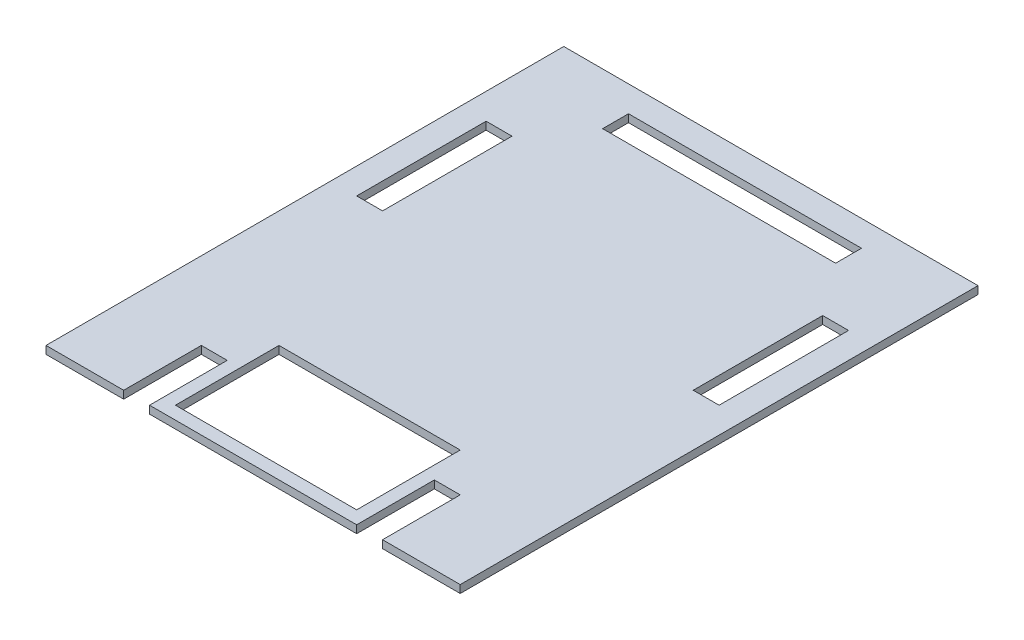
ISO-10303-21;
HEADER;
FILE_DESCRIPTION(('STEP AP214'),'2;1');
FILE_NAME('part.step','',(''),(''),'','','');
FILE_SCHEMA(('AUTOMOTIVE_DESIGN { 1 0 10303 214 1 1 1 1 }'));
ENDSEC;
DATA;
#1=APPLICATION_CONTEXT('core data for automotive mechanical design processes');
#2=APPLICATION_PROTOCOL_DEFINITION('international standard','automotive_design',2000,#1);
#3=PRODUCT_CONTEXT('',#1,'mechanical');
#4=PRODUCT('Part','Part','',(#3));
#5=PRODUCT_RELATED_PRODUCT_CATEGORY('part','',(#4));
#6=PRODUCT_DEFINITION_FORMATION('','',#4);
#7=PRODUCT_DEFINITION_CONTEXT('part definition',#1,'design');
#8=PRODUCT_DEFINITION('design','',#6,#7);
#9=PRODUCT_DEFINITION_SHAPE('','',#8);
#10=(LENGTH_UNIT() NAMED_UNIT(*) SI_UNIT(.MILLI.,.METRE.));
#11=(NAMED_UNIT(*) PLANE_ANGLE_UNIT() SI_UNIT($,.RADIAN.));
#12=(NAMED_UNIT(*) SI_UNIT($,.STERADIAN.) SOLID_ANGLE_UNIT());
#13=UNCERTAINTY_MEASURE_WITH_UNIT(LENGTH_MEASURE(1.E-05),#10,'distance_accuracy_value','');
#14=(GEOMETRIC_REPRESENTATION_CONTEXT(3) GLOBAL_UNCERTAINTY_ASSIGNED_CONTEXT((#13)) GLOBAL_UNIT_ASSIGNED_CONTEXT((#10,
#11,#12)) REPRESENTATION_CONTEXT('',''));
#15=CARTESIAN_POINT('',(0.,0.,0.));
#16=DIRECTION('',(0.,0.,1.));
#17=DIRECTION('',(1.,0.,0.));
#18=AXIS2_PLACEMENT_3D('',#15,#16,#17);
#19=CARTESIAN_POINT('',(0.,3.,-3.62105263157893));
#20=DIRECTION('',(0.,0.,1.));
#21=DIRECTION('',(1.,0.,0.));
#22=AXIS2_PLACEMENT_3D('',#19,#20,#21);
#23=PLANE('',#22);
#24=DIRECTION('',(-1.,0.,0.));
#25=VECTOR('',#24,1.);
#26=CARTESIAN_POINT('',(0.,0.,-3.62105263157893));
#27=LINE('',#26,#25);
#28=CARTESIAN_POINT('',(-60.,0.,-3.62105263157893));
#29=VERTEX_POINT('',#28);
#30=CARTESIAN_POINT('',(-70.,0.,-3.62105263157893));
#31=VERTEX_POINT('',#30);
#32=EDGE_CURVE('E385',#29,#31,#27,.T.);
#33=ORIENTED_EDGE('',*,*,#32,.F.);
#34=DIRECTION('',(0.,-1.,0.));
#35=VECTOR('',#34,1.);
#36=CARTESIAN_POINT('',(-60.,3.,-3.62105263157893));
#37=LINE('',#36,#35);
#38=CARTESIAN_POINT('',(-60.,3.,-3.62105263157893));
#39=VERTEX_POINT('',#38);
#40=EDGE_CURVE('E11',#39,#29,#37,.T.);
#41=ORIENTED_EDGE('',*,*,#40,.F.);
#42=DIRECTION('',(-1.,0.,0.));
#43=VECTOR('',#42,1.);
#44=CARTESIAN_POINT('',(0.,3.,-3.62105263157893));
#45=LINE('',#44,#43);
#46=CARTESIAN_POINT('',(-70.,3.,-3.62105263157893));
#47=VERTEX_POINT('',#46);
#48=EDGE_CURVE('E240',#39,#47,#45,.T.);
#49=ORIENTED_EDGE('',*,*,#48,.T.);
#50=DIRECTION('',(0.,-1.,0.));
#51=VECTOR('',#50,1.);
#52=CARTESIAN_POINT('',(-70.,3.,-3.62105263157893));
#53=LINE('',#52,#51);
#54=EDGE_CURVE('E54',#47,#31,#53,.T.);
#55=ORIENTED_EDGE('',*,*,#54,.T.);
#56=EDGE_LOOP('',(#33,#41,#49,#55));
#57=FACE_BOUND('',#56,.T.);
#58=ADVANCED_FACE('F35',(#57),#23,.T.);
#59=CARTESIAN_POINT('',(-60.,3.,0.));
#60=DIRECTION('',(1.,0.,0.));
#61=DIRECTION('',(0.,0.,-1.));
#62=AXIS2_PLACEMENT_3D('',#59,#60,#61);
#63=PLANE('',#62);
#64=DIRECTION('',(0.,0.,1.));
#65=VECTOR('',#64,1.);
#66=CARTESIAN_POINT('',(-60.,0.,0.));
#67=LINE('',#66,#65);
#68=CARTESIAN_POINT('',(-60.,0.,46.3789473684211));
#69=VERTEX_POINT('',#68);
#70=EDGE_CURVE('E245',#29,#69,#67,.T.);
#71=ORIENTED_EDGE('',*,*,#70,.T.);
#72=DIRECTION('',(0.,-1.,0.));
#73=VECTOR('',#72,1.);
#74=CARTESIAN_POINT('',(-60.,3.,46.3789473684211));
#75=LINE('',#74,#73);
#76=CARTESIAN_POINT('',(-60.,3.,46.3789473684211));
#77=VERTEX_POINT('',#76);
#78=EDGE_CURVE('E45',#77,#69,#75,.T.);
#79=ORIENTED_EDGE('',*,*,#78,.F.);
#80=DIRECTION('',(0.,0.,1.));
#81=VECTOR('',#80,1.);
#82=CARTESIAN_POINT('',(-60.,3.,0.));
#83=LINE('',#82,#81);
#84=EDGE_CURVE('E235',#39,#77,#83,.T.);
#85=ORIENTED_EDGE('',*,*,#84,.F.);
#86=ORIENTED_EDGE('',*,*,#40,.T.);
#87=EDGE_LOOP('',(#71,#79,#85,#86));
#88=FACE_BOUND('',#87,.T.);
#89=ADVANCED_FACE('F243',(#88),#63,.F.);
#90=CARTESIAN_POINT('',(0.,3.,46.3789473684211));
#91=DIRECTION('',(0.,0.,1.));
#92=DIRECTION('',(1.,0.,0.));
#93=AXIS2_PLACEMENT_3D('',#90,#91,#92);
#94=PLANE('',#93);
#95=DIRECTION('',(-1.,0.,0.));
#96=VECTOR('',#95,1.);
#97=CARTESIAN_POINT('',(0.,0.,46.3789473684211));
#98=LINE('',#97,#96);
#99=CARTESIAN_POINT('',(-70.,0.,46.3789473684211));
#100=VERTEX_POINT('',#99);
#101=EDGE_CURVE('E388',#69,#100,#98,.T.);
#102=ORIENTED_EDGE('',*,*,#101,.T.);
#103=DIRECTION('',(0.,-1.,0.));
#104=VECTOR('',#103,1.);
#105=CARTESIAN_POINT('',(-70.,3.,46.3789473684211));
#106=LINE('',#105,#104);
#107=CARTESIAN_POINT('',(-70.,3.,46.3789473684211));
#108=VERTEX_POINT('',#107);
#109=EDGE_CURVE('E140',#108,#100,#106,.T.);
#110=ORIENTED_EDGE('',*,*,#109,.F.);
#111=DIRECTION('',(-1.,0.,0.));
#112=VECTOR('',#111,1.);
#113=CARTESIAN_POINT('',(0.,3.,46.3789473684211));
#114=LINE('',#113,#112);
#115=EDGE_CURVE('E227',#77,#108,#114,.T.);
#116=ORIENTED_EDGE('',*,*,#115,.F.);
#117=ORIENTED_EDGE('',*,*,#78,.T.);
#118=EDGE_LOOP('',(#102,#110,#116,#117));
#119=FACE_BOUND('',#118,.T.);
#120=ADVANCED_FACE('F229',(#119),#94,.F.);
#121=CARTESIAN_POINT('',(0.,3.,-43.6210526315789));
#122=DIRECTION('',(0.,0.,-1.));
#123=DIRECTION('',(-1.,0.,0.));
#124=AXIS2_PLACEMENT_3D('',#121,#122,#123);
#125=PLANE('',#124);
#126=DIRECTION('',(1.,0.,0.));
#127=VECTOR('',#126,1.);
#128=CARTESIAN_POINT('',(0.,0.,-43.6210526315789));
#129=LINE('',#128,#127);
#130=CARTESIAN_POINT('',(-80.,0.,-43.6210526315789));
#131=VERTEX_POINT('',#130);
#132=CARTESIAN_POINT('',(80.,0.,-43.6210526315789));
#133=VERTEX_POINT('',#132);
#134=EDGE_CURVE('E351',#131,#133,#129,.T.);
#135=ORIENTED_EDGE('',*,*,#134,.F.);
#136=DIRECTION('',(0.,-1.,0.));
#137=VECTOR('',#136,1.);
#138=CARTESIAN_POINT('',(-80.,3.,-43.6210526315789));
#139=LINE('',#138,#137);
#140=CARTESIAN_POINT('',(-80.,3.,-43.6210526315789));
#141=VERTEX_POINT('',#140);
#142=EDGE_CURVE('E277',#141,#131,#139,.T.);
#143=ORIENTED_EDGE('',*,*,#142,.F.);
#144=DIRECTION('',(1.,0.,0.));
#145=VECTOR('',#144,1.);
#146=CARTESIAN_POINT('',(0.,3.,-43.6210526315789));
#147=LINE('',#146,#145);
#148=CARTESIAN_POINT('',(80.,3.,-43.6210526315789));
#149=VERTEX_POINT('',#148);
#150=EDGE_CURVE('E425',#141,#149,#147,.T.);
#151=ORIENTED_EDGE('',*,*,#150,.T.);
#152=DIRECTION('',(0.,-1.,0.));
#153=VECTOR('',#152,1.);
#154=CARTESIAN_POINT('',(80.,3.,-43.6210526315789));
#155=LINE('',#154,#153);
#156=EDGE_CURVE('E250',#149,#133,#155,.T.);
#157=ORIENTED_EDGE('',*,*,#156,.T.);
#158=EDGE_LOOP('',(#135,#143,#151,#157));
#159=FACE_BOUND('',#158,.T.);
#160=ADVANCED_FACE('F522',(#159),#125,.T.);
#161=CARTESIAN_POINT('',(-80.,3.,0.));
#162=DIRECTION('',(1.,0.,0.));
#163=DIRECTION('',(0.,0.,-1.));
#164=AXIS2_PLACEMENT_3D('',#161,#162,#163);
#165=PLANE('',#164);
#166=DIRECTION('',(0.,0.,1.));
#167=VECTOR('',#166,1.);
#168=CARTESIAN_POINT('',(-80.,0.,0.));
#169=LINE('',#168,#167);
#170=CARTESIAN_POINT('',(-80.,0.,156.378947368421));
#171=VERTEX_POINT('',#170);
#172=EDGE_CURVE('E354',#131,#171,#169,.T.);
#173=ORIENTED_EDGE('',*,*,#172,.T.);
#174=DIRECTION('',(0.,-1.,0.));
#175=VECTOR('',#174,1.);
#176=CARTESIAN_POINT('',(-80.,3.,156.378947368421));
#177=LINE('',#176,#175);
#178=CARTESIAN_POINT('',(-80.,3.,156.378947368421));
#179=VERTEX_POINT('',#178);
#180=EDGE_CURVE('E274',#179,#171,#177,.T.);
#181=ORIENTED_EDGE('',*,*,#180,.F.);
#182=DIRECTION('',(0.,0.,1.));
#183=VECTOR('',#182,1.);
#184=CARTESIAN_POINT('',(-80.,3.,0.));
#185=LINE('',#184,#183);
#186=EDGE_CURVE('E428',#141,#179,#185,.T.);
#187=ORIENTED_EDGE('',*,*,#186,.F.);
#188=ORIENTED_EDGE('',*,*,#142,.T.);
#189=EDGE_LOOP('',(#173,#181,#187,#188));
#190=FACE_BOUND('',#189,.T.);
#191=ADVANCED_FACE('F518',(#190),#165,.F.);
#192=CARTESIAN_POINT('',(0.,3.,156.378947368421));
#193=DIRECTION('',(0.,0.,-1.));
#194=DIRECTION('',(-1.,0.,0.));
#195=AXIS2_PLACEMENT_3D('',#192,#193,#194);
#196=PLANE('',#195);
#197=DIRECTION('',(1.,0.,0.));
#198=VECTOR('',#197,1.);
#199=CARTESIAN_POINT('',(0.,0.,156.378947368421));
#200=LINE('',#199,#198);
#201=CARTESIAN_POINT('',(-50.,0.,156.378947368421));
#202=VERTEX_POINT('',#201);
#203=EDGE_CURVE('E357',#171,#202,#200,.T.);
#204=ORIENTED_EDGE('',*,*,#203,.T.);
#205=DIRECTION('',(0.,-1.,0.));
#206=VECTOR('',#205,1.);
#207=CARTESIAN_POINT('',(-50.,3.,156.378947368421));
#208=LINE('',#207,#206);
#209=CARTESIAN_POINT('',(-50.,3.,156.378947368421));
#210=VERTEX_POINT('',#209);
#211=EDGE_CURVE('E271',#210,#202,#208,.T.);
#212=ORIENTED_EDGE('',*,*,#211,.F.);
#213=DIRECTION('',(1.,0.,0.));
#214=VECTOR('',#213,1.);
#215=CARTESIAN_POINT('',(0.,3.,156.378947368421));
#216=LINE('',#215,#214);
#217=EDGE_CURVE('E431',#179,#210,#216,.T.);
#218=ORIENTED_EDGE('',*,*,#217,.F.);
#219=ORIENTED_EDGE('',*,*,#180,.T.);
#220=EDGE_LOOP('',(#204,#212,#218,#219));
#221=FACE_BOUND('',#220,.T.);
#222=ADVANCED_FACE('F514',(#221),#196,.F.);
#223=CARTESIAN_POINT('',(-50.,3.,0.));
#224=DIRECTION('',(-1.,0.,0.));
#225=DIRECTION('',(0.,0.,1.));
#226=AXIS2_PLACEMENT_3D('',#223,#224,#225);
#227=PLANE('',#226);
#228=DIRECTION('',(0.,0.,-1.));
#229=VECTOR('',#228,1.);
#230=CARTESIAN_POINT('',(-50.,0.,0.));
#231=LINE('',#230,#229);
#232=CARTESIAN_POINT('',(-50.,0.,126.378947368421));
#233=VERTEX_POINT('',#232);
#234=EDGE_CURVE('E360',#202,#233,#231,.T.);
#235=ORIENTED_EDGE('',*,*,#234,.T.);
#236=DIRECTION('',(0.,-1.,0.));
#237=VECTOR('',#236,1.);
#238=CARTESIAN_POINT('',(-50.,3.,126.378947368421));
#239=LINE('',#238,#237);
#240=CARTESIAN_POINT('',(-50.,3.,126.378947368421));
#241=VERTEX_POINT('',#240);
#242=EDGE_CURVE('E268',#241,#233,#239,.T.);
#243=ORIENTED_EDGE('',*,*,#242,.F.);
#244=DIRECTION('',(0.,0.,-1.));
#245=VECTOR('',#244,1.);
#246=CARTESIAN_POINT('',(-50.,3.,0.));
#247=LINE('',#246,#245);
#248=EDGE_CURVE('E434',#210,#241,#247,.T.);
#249=ORIENTED_EDGE('',*,*,#248,.F.);
#250=ORIENTED_EDGE('',*,*,#211,.T.);
#251=EDGE_LOOP('',(#235,#243,#249,#250));
#252=FACE_BOUND('',#251,.T.);
#253=ADVANCED_FACE('F510',(#252),#227,.F.);
#254=CARTESIAN_POINT('',(0.,3.,126.378947368421));
#255=DIRECTION('',(0.,0.,-1.));
#256=DIRECTION('',(-1.,0.,0.));
#257=AXIS2_PLACEMENT_3D('',#254,#255,#256);
#258=PLANE('',#257);
#259=DIRECTION('',(1.,0.,0.));
#260=VECTOR('',#259,1.);
#261=CARTESIAN_POINT('',(0.,0.,126.378947368421));
#262=LINE('',#261,#260);
#263=CARTESIAN_POINT('',(-40.,0.,126.378947368421));
#264=VERTEX_POINT('',#263);
#265=EDGE_CURVE('E363',#233,#264,#262,.T.);
#266=ORIENTED_EDGE('',*,*,#265,.T.);
#267=DIRECTION('',(0.,-1.,0.));
#268=VECTOR('',#267,1.);
#269=CARTESIAN_POINT('',(-40.,3.,126.378947368421));
#270=LINE('',#269,#268);
#271=CARTESIAN_POINT('',(-40.,3.,126.378947368421));
#272=VERTEX_POINT('',#271);
#273=EDGE_CURVE('E266',#272,#264,#270,.T.);
#274=ORIENTED_EDGE('',*,*,#273,.F.);
#275=DIRECTION('',(1.,0.,0.));
#276=VECTOR('',#275,1.);
#277=CARTESIAN_POINT('',(0.,3.,126.378947368421));
#278=LINE('',#277,#276);
#279=EDGE_CURVE('E437',#241,#272,#278,.T.);
#280=ORIENTED_EDGE('',*,*,#279,.F.);
#281=ORIENTED_EDGE('',*,*,#242,.T.);
#282=EDGE_LOOP('',(#266,#274,#280,#281));
#283=FACE_BOUND('',#282,.T.);
#284=ADVANCED_FACE('F506',(#283),#258,.F.);
#285=CARTESIAN_POINT('',(-40.,3.,0.));
#286=DIRECTION('',(-1.,0.,0.));
#287=DIRECTION('',(0.,0.,1.));
#288=AXIS2_PLACEMENT_3D('',#285,#286,#287);
#289=PLANE('',#288);
#290=DIRECTION('',(0.,0.,-1.));
#291=VECTOR('',#290,1.);
#292=CARTESIAN_POINT('',(-40.,0.,0.));
#293=LINE('',#292,#291);
#294=CARTESIAN_POINT('',(-40.,0.,156.378947368421));
#295=VERTEX_POINT('',#294);
#296=EDGE_CURVE('E366',#295,#264,#293,.T.);
#297=ORIENTED_EDGE('',*,*,#296,.F.);
#298=DIRECTION('',(0.,-1.,0.));
#299=VECTOR('',#298,1.);
#300=CARTESIAN_POINT('',(-40.,3.,156.378947368421));
#301=LINE('',#300,#299);
#302=CARTESIAN_POINT('',(-40.,3.,156.378947368421));
#303=VERTEX_POINT('',#302);
#304=EDGE_CURVE('E264',#303,#295,#301,.T.);
#305=ORIENTED_EDGE('',*,*,#304,.F.);
#306=DIRECTION('',(0.,0.,-1.));
#307=VECTOR('',#306,1.);
#308=CARTESIAN_POINT('',(-40.,3.,0.));
#309=LINE('',#308,#307);
#310=EDGE_CURVE('E439',#303,#272,#309,.T.);
#311=ORIENTED_EDGE('',*,*,#310,.T.);
#312=ORIENTED_EDGE('',*,*,#273,.T.);
#313=EDGE_LOOP('',(#297,#305,#311,#312));
#314=FACE_BOUND('',#313,.T.);
#315=ADVANCED_FACE('F503',(#314),#289,.T.);
#316=CARTESIAN_POINT('',(0.,3.,156.378947368421));
#317=DIRECTION('',(0.,0.,-1.));
#318=DIRECTION('',(-1.,0.,0.));
#319=AXIS2_PLACEMENT_3D('',#316,#317,#318);
#320=PLANE('',#319);
#321=DIRECTION('',(1.,0.,0.));
#322=VECTOR('',#321,1.);
#323=CARTESIAN_POINT('',(0.,0.,156.378947368421));
#324=LINE('',#323,#322);
#325=CARTESIAN_POINT('',(40.,0.,156.378947368421));
#326=VERTEX_POINT('',#325);
#327=EDGE_CURVE('E369',#295,#326,#324,.T.);
#328=ORIENTED_EDGE('',*,*,#327,.T.);
#329=DIRECTION('',(0.,-1.,0.));
#330=VECTOR('',#329,1.);
#331=CARTESIAN_POINT('',(40.,3.,156.378947368421));
#332=LINE('',#331,#330);
#333=CARTESIAN_POINT('',(40.,3.,156.378947368421));
#334=VERTEX_POINT('',#333);
#335=EDGE_CURVE('E261',#334,#326,#332,.T.);
#336=ORIENTED_EDGE('',*,*,#335,.F.);
#337=DIRECTION('',(1.,0.,0.));
#338=VECTOR('',#337,1.);
#339=CARTESIAN_POINT('',(0.,3.,156.378947368421));
#340=LINE('',#339,#338);
#341=EDGE_CURVE('E442',#303,#334,#340,.T.);
#342=ORIENTED_EDGE('',*,*,#341,.F.);
#343=ORIENTED_EDGE('',*,*,#304,.T.);
#344=EDGE_LOOP('',(#328,#336,#342,#343));
#345=FACE_BOUND('',#344,.T.);
#346=ADVANCED_FACE('F491',(#345),#320,.F.);
#347=CARTESIAN_POINT('',(40.,3.,0.));
#348=DIRECTION('',(-1.,0.,0.));
#349=DIRECTION('',(0.,0.,1.));
#350=AXIS2_PLACEMENT_3D('',#347,#348,#349);
#351=PLANE('',#350);
#352=DIRECTION('',(0.,0.,-1.));
#353=VECTOR('',#352,1.);
#354=CARTESIAN_POINT('',(40.,0.,0.));
#355=LINE('',#354,#353);
#356=CARTESIAN_POINT('',(40.,0.,126.378947368421));
#357=VERTEX_POINT('',#356);
#358=EDGE_CURVE('E372',#326,#357,#355,.T.);
#359=ORIENTED_EDGE('',*,*,#358,.T.);
#360=DIRECTION('',(0.,-1.,0.));
#361=VECTOR('',#360,1.);
#362=CARTESIAN_POINT('',(40.,3.,126.378947368421));
#363=LINE('',#362,#361);
#364=CARTESIAN_POINT('',(40.,3.,126.378947368421));
#365=VERTEX_POINT('',#364);
#366=EDGE_CURVE('E259',#365,#357,#363,.T.);
#367=ORIENTED_EDGE('',*,*,#366,.F.);
#368=DIRECTION('',(0.,0.,-1.));
#369=VECTOR('',#368,1.);
#370=CARTESIAN_POINT('',(40.,3.,0.));
#371=LINE('',#370,#369);
#372=EDGE_CURVE('E445',#334,#365,#371,.T.);
#373=ORIENTED_EDGE('',*,*,#372,.F.);
#374=ORIENTED_EDGE('',*,*,#335,.T.);
#375=EDGE_LOOP('',(#359,#367,#373,#374));
#376=FACE_BOUND('',#375,.T.);
#377=ADVANCED_FACE('F498',(#376),#351,.F.);
#378=CARTESIAN_POINT('',(0.,3.,126.378947368421));
#379=DIRECTION('',(0.,0.,1.));
#380=DIRECTION('',(1.,0.,0.));
#381=AXIS2_PLACEMENT_3D('',#378,#379,#380);
#382=PLANE('',#381);
#383=DIRECTION('',(-1.,0.,0.));
#384=VECTOR('',#383,1.);
#385=CARTESIAN_POINT('',(0.,0.,126.378947368421));
#386=LINE('',#385,#384);
#387=CARTESIAN_POINT('',(50.,0.,126.378947368421));
#388=VERTEX_POINT('',#387);
#389=EDGE_CURVE('E376',#388,#357,#386,.T.);
#390=ORIENTED_EDGE('',*,*,#389,.F.);
#391=DIRECTION('',(0.,-1.,0.));
#392=VECTOR('',#391,1.);
#393=CARTESIAN_POINT('',(50.,3.,126.378947368421));
#394=LINE('',#393,#392);
#395=CARTESIAN_POINT('',(50.,3.,126.378947368421));
#396=VERTEX_POINT('',#395);
#397=EDGE_CURVE('E257',#396,#388,#394,.T.);
#398=ORIENTED_EDGE('',*,*,#397,.F.);
#399=DIRECTION('',(-1.,0.,0.));
#400=VECTOR('',#399,1.);
#401=CARTESIAN_POINT('',(0.,3.,126.378947368421));
#402=LINE('',#401,#400);
#403=EDGE_CURVE('E448',#396,#365,#402,.T.);
#404=ORIENTED_EDGE('',*,*,#403,.T.);
#405=ORIENTED_EDGE('',*,*,#366,.T.);
#406=EDGE_LOOP('',(#390,#398,#404,#405));
#407=FACE_BOUND('',#406,.T.);
#408=ADVANCED_FACE('F494',(#407),#382,.T.);
#409=CARTESIAN_POINT('',(50.,3.,0.));
#410=DIRECTION('',(-1.,0.,0.));
#411=DIRECTION('',(0.,0.,1.));
#412=AXIS2_PLACEMENT_3D('',#409,#410,#411);
#413=PLANE('',#412);
#414=DIRECTION('',(0.,0.,-1.));
#415=VECTOR('',#414,1.);
#416=CARTESIAN_POINT('',(50.,0.,0.));
#417=LINE('',#416,#415);
#418=CARTESIAN_POINT('',(50.,0.,156.378947368421));
#419=VERTEX_POINT('',#418);
#420=EDGE_CURVE('E379',#419,#388,#417,.T.);
#421=ORIENTED_EDGE('',*,*,#420,.F.);
#422=DIRECTION('',(0.,-1.,0.));
#423=VECTOR('',#422,1.);
#424=CARTESIAN_POINT('',(50.,3.,156.378947368421));
#425=LINE('',#424,#423);
#426=CARTESIAN_POINT('',(50.,3.,156.378947368421));
#427=VERTEX_POINT('',#426);
#428=EDGE_CURVE('E255',#427,#419,#425,.T.);
#429=ORIENTED_EDGE('',*,*,#428,.F.);
#430=DIRECTION('',(0.,0.,-1.));
#431=VECTOR('',#430,1.);
#432=CARTESIAN_POINT('',(50.,3.,0.));
#433=LINE('',#432,#431);
#434=EDGE_CURVE('E451',#427,#396,#433,.T.);
#435=ORIENTED_EDGE('',*,*,#434,.T.);
#436=ORIENTED_EDGE('',*,*,#397,.T.);
#437=EDGE_LOOP('',(#421,#429,#435,#436));
#438=FACE_BOUND('',#437,.T.);
#439=ADVANCED_FACE('F489',(#438),#413,.T.);
#440=CARTESIAN_POINT('',(80.,0.,156.378947368421));
#441=VERTEX_POINT('',#440);
#442=EDGE_CURVE('E373',#419,#441,#324,.T.);
#443=ORIENTED_EDGE('',*,*,#442,.T.);
#444=DIRECTION('',(0.,-1.,0.));
#445=VECTOR('',#444,1.);
#446=CARTESIAN_POINT('',(80.,3.,156.378947368421));
#447=LINE('',#446,#445);
#448=CARTESIAN_POINT('',(80.,3.,156.378947368421));
#449=VERTEX_POINT('',#448);
#450=EDGE_CURVE('E252',#449,#441,#447,.T.);
#451=ORIENTED_EDGE('',*,*,#450,.F.);
#452=EDGE_CURVE('E446',#427,#449,#340,.T.);
#453=ORIENTED_EDGE('',*,*,#452,.F.);
#454=ORIENTED_EDGE('',*,*,#428,.T.);
#455=EDGE_LOOP('',(#443,#451,#453,#454));
#456=FACE_BOUND('',#455,.T.);
#457=ADVANCED_FACE('F485',(#456),#320,.F.);
#458=CARTESIAN_POINT('',(0.,3.,-3.62105263157893));
#459=DIRECTION('',(0.,0.,-1.));
#460=DIRECTION('',(-1.,0.,0.));
#461=AXIS2_PLACEMENT_3D('',#458,#459,#460);
#462=PLANE('',#461);
#463=DIRECTION('',(1.,0.,0.));
#464=VECTOR('',#463,1.);
#465=CARTESIAN_POINT('',(0.,0.,-3.62105263157893));
#466=LINE('',#465,#464);
#467=CARTESIAN_POINT('',(60.,0.,-3.62105263157893));
#468=VERTEX_POINT('',#467);
#469=CARTESIAN_POINT('',(70.,0.,-3.62105263157893));
#470=VERTEX_POINT('',#469);
#471=EDGE_CURVE('E339',#468,#470,#466,.T.);
#472=ORIENTED_EDGE('',*,*,#471,.T.);
#473=DIRECTION('',(0.,-1.,0.));
#474=VECTOR('',#473,1.);
#475=CARTESIAN_POINT('',(70.,3.,-3.62105263157893));
#476=LINE('',#475,#474);
#477=CARTESIAN_POINT('',(70.,3.,-3.62105263157893));
#478=VERTEX_POINT('',#477);
#479=EDGE_CURVE('E253',#478,#470,#476,.T.);
#480=ORIENTED_EDGE('',*,*,#479,.F.);
#481=DIRECTION('',(1.,0.,0.));
#482=VECTOR('',#481,1.);
#483=CARTESIAN_POINT('',(0.,3.,-3.62105263157893));
#484=LINE('',#483,#482);
#485=CARTESIAN_POINT('',(60.,3.,-3.62105263157893));
#486=VERTEX_POINT('',#485);
#487=EDGE_CURVE('E414',#486,#478,#484,.T.);
#488=ORIENTED_EDGE('',*,*,#487,.F.);
#489=DIRECTION('',(0.,-1.,0.));
#490=VECTOR('',#489,1.);
#491=CARTESIAN_POINT('',(60.,3.,-3.62105263157893));
#492=LINE('',#491,#490);
#493=EDGE_CURVE('E279',#486,#468,#492,.T.);
#494=ORIENTED_EDGE('',*,*,#493,.T.);
#495=EDGE_LOOP('',(#472,#480,#488,#494));
#496=FACE_BOUND('',#495,.T.);
#497=ADVANCED_FACE('F488',(#496),#462,.F.);
#498=CARTESIAN_POINT('',(70.,3.,0.));
#499=DIRECTION('',(1.,0.,0.));
#500=DIRECTION('',(0.,0.,-1.));
#501=AXIS2_PLACEMENT_3D('',#498,#499,#500);
#502=PLANE('',#501);
#503=DIRECTION('',(0.,0.,1.));
#504=VECTOR('',#503,1.);
#505=CARTESIAN_POINT('',(70.,0.,0.));
#506=LINE('',#505,#504);
#507=CARTESIAN_POINT('',(70.,0.,46.3789473684211));
#508=VERTEX_POINT('',#507);
#509=EDGE_CURVE('E342',#470,#508,#506,.T.);
#510=ORIENTED_EDGE('',*,*,#509,.T.);
#511=DIRECTION('',(0.,-1.,0.));
#512=VECTOR('',#511,1.);
#513=CARTESIAN_POINT('',(70.,3.,46.3789473684211));
#514=LINE('',#513,#512);
#515=CARTESIAN_POINT('',(70.,3.,46.3789473684211));
#516=VERTEX_POINT('',#515);
#517=EDGE_CURVE('E284',#516,#508,#514,.T.);
#518=ORIENTED_EDGE('',*,*,#517,.F.);
#519=DIRECTION('',(0.,0.,1.));
#520=VECTOR('',#519,1.);
#521=CARTESIAN_POINT('',(70.,3.,0.));
#522=LINE('',#521,#520);
#523=EDGE_CURVE('E417',#478,#516,#522,.T.);
#524=ORIENTED_EDGE('',*,*,#523,.F.);
#525=ORIENTED_EDGE('',*,*,#479,.T.);
#526=EDGE_LOOP('',(#510,#518,#524,#525));
#527=FACE_BOUND('',#526,.T.);
#528=ADVANCED_FACE('F534',(#527),#502,.F.);
#529=CARTESIAN_POINT('',(0.,3.,46.3789473684211));
#530=DIRECTION('',(0.,0.,-1.));
#531=DIRECTION('',(-1.,0.,0.));
#532=AXIS2_PLACEMENT_3D('',#529,#530,#531);
#533=PLANE('',#532);
#534=DIRECTION('',(1.,0.,0.));
#535=VECTOR('',#534,1.);
#536=CARTESIAN_POINT('',(0.,0.,46.3789473684211));
#537=LINE('',#536,#535);
#538=CARTESIAN_POINT('',(60.,0.,46.3789473684211));
#539=VERTEX_POINT('',#538);
#540=EDGE_CURVE('E345',#539,#508,#537,.T.);
#541=ORIENTED_EDGE('',*,*,#540,.F.);
#542=DIRECTION('',(0.,-1.,0.));
#543=VECTOR('',#542,1.);
#544=CARTESIAN_POINT('',(60.,3.,46.3789473684211));
#545=LINE('',#544,#543);
#546=CARTESIAN_POINT('',(60.,3.,46.3789473684211));
#547=VERTEX_POINT('',#546);
#548=EDGE_CURVE('E281',#547,#539,#545,.T.);
#549=ORIENTED_EDGE('',*,*,#548,.F.);
#550=DIRECTION('',(1.,0.,0.));
#551=VECTOR('',#550,1.);
#552=CARTESIAN_POINT('',(0.,3.,46.3789473684211));
#553=LINE('',#552,#551);
#554=EDGE_CURVE('E419',#547,#516,#553,.T.);
#555=ORIENTED_EDGE('',*,*,#554,.T.);
#556=ORIENTED_EDGE('',*,*,#517,.T.);
#557=EDGE_LOOP('',(#541,#549,#555,#556));
#558=FACE_BOUND('',#557,.T.);
#559=ADVANCED_FACE('F530',(#558),#533,.T.);
#560=CARTESIAN_POINT('',(-35.,3.,0.));
#561=DIRECTION('',(-1.,0.,0.));
#562=DIRECTION('',(0.,0.,1.));
#563=AXIS2_PLACEMENT_3D('',#560,#561,#562);
#564=PLANE('',#563);
#565=DIRECTION('',(0.,0.,-1.));
#566=VECTOR('',#565,1.);
#567=CARTESIAN_POINT('',(-35.,0.,0.));
#568=LINE('',#567,#566);
#569=CARTESIAN_POINT('',(-35.,0.,151.378947368421));
#570=VERTEX_POINT('',#569);
#571=CARTESIAN_POINT('',(-35.,0.,111.378947368421));
#572=VERTEX_POINT('',#571);
#573=EDGE_CURVE('E327',#570,#572,#568,.T.);
#574=ORIENTED_EDGE('',*,*,#573,.T.);
#575=DIRECTION('',(0.,-1.,0.));
#576=VECTOR('',#575,1.);
#577=CARTESIAN_POINT('',(-35.,3.,111.378947368421));
#578=LINE('',#577,#576);
#579=CARTESIAN_POINT('',(-35.,3.,111.378947368421));
#580=VERTEX_POINT('',#579);
#581=EDGE_CURVE('E282',#580,#572,#578,.T.);
#582=ORIENTED_EDGE('',*,*,#581,.F.);
#583=DIRECTION('',(0.,0.,-1.));
#584=VECTOR('',#583,1.);
#585=CARTESIAN_POINT('',(-35.,3.,0.));
#586=LINE('',#585,#584);
#587=CARTESIAN_POINT('',(-35.,3.,151.378947368421));
#588=VERTEX_POINT('',#587);
#589=EDGE_CURVE('E403',#588,#580,#586,.T.);
#590=ORIENTED_EDGE('',*,*,#589,.F.);
#591=DIRECTION('',(0.,-1.,0.));
#592=VECTOR('',#591,1.);
#593=CARTESIAN_POINT('',(-35.,3.,151.378947368421));
#594=LINE('',#593,#592);
#595=EDGE_CURVE('E288',#588,#570,#594,.T.);
#596=ORIENTED_EDGE('',*,*,#595,.T.);
#597=EDGE_LOOP('',(#574,#582,#590,#596));
#598=FACE_BOUND('',#597,.T.);
#599=ADVANCED_FACE('F533',(#598),#564,.F.);
#600=CARTESIAN_POINT('',(0.,3.,111.378947368421));
#601=DIRECTION('',(0.,0.,-1.));
#602=DIRECTION('',(-1.,0.,0.));
#603=AXIS2_PLACEMENT_3D('',#600,#601,#602);
#604=PLANE('',#603);
#605=DIRECTION('',(1.,0.,0.));
#606=VECTOR('',#605,1.);
#607=CARTESIAN_POINT('',(0.,0.,111.378947368421));
#608=LINE('',#607,#606);
#609=CARTESIAN_POINT('',(35.,0.,111.378947368421));
#610=VERTEX_POINT('',#609);
#611=EDGE_CURVE('E330',#572,#610,#608,.T.);
#612=ORIENTED_EDGE('',*,*,#611,.T.);
#613=DIRECTION('',(0.,-1.,0.));
#614=VECTOR('',#613,1.);
#615=CARTESIAN_POINT('',(35.,3.,111.378947368421));
#616=LINE('',#615,#614);
#617=CARTESIAN_POINT('',(35.,3.,111.378947368421));
#618=VERTEX_POINT('',#617);
#619=EDGE_CURVE('E292',#618,#610,#616,.T.);
#620=ORIENTED_EDGE('',*,*,#619,.F.);
#621=DIRECTION('',(1.,0.,0.));
#622=VECTOR('',#621,1.);
#623=CARTESIAN_POINT('',(0.,3.,111.378947368421));
#624=LINE('',#623,#622);
#625=EDGE_CURVE('E406',#580,#618,#624,.T.);
#626=ORIENTED_EDGE('',*,*,#625,.F.);
#627=ORIENTED_EDGE('',*,*,#581,.T.);
#628=EDGE_LOOP('',(#612,#620,#626,#627));
#629=FACE_BOUND('',#628,.T.);
#630=ADVANCED_FACE('F548',(#629),#604,.F.);
#631=CARTESIAN_POINT('',(35.,3.,0.));
#632=DIRECTION('',(-1.,0.,0.));
#633=DIRECTION('',(0.,0.,1.));
#634=AXIS2_PLACEMENT_3D('',#631,#632,#633);
#635=PLANE('',#634);
#636=DIRECTION('',(0.,0.,-1.));
#637=VECTOR('',#636,1.);
#638=CARTESIAN_POINT('',(35.,0.,0.));
#639=LINE('',#638,#637);
#640=CARTESIAN_POINT('',(35.,0.,151.378947368421));
#641=VERTEX_POINT('',#640);
#642=EDGE_CURVE('E333',#641,#610,#639,.T.);
#643=ORIENTED_EDGE('',*,*,#642,.F.);
#644=DIRECTION('',(0.,-1.,0.));
#645=VECTOR('',#644,1.);
#646=CARTESIAN_POINT('',(35.,3.,151.378947368421));
#647=LINE('',#646,#645);
#648=CARTESIAN_POINT('',(35.,3.,151.378947368421));
#649=VERTEX_POINT('',#648);
#650=EDGE_CURVE('E290',#649,#641,#647,.T.);
#651=ORIENTED_EDGE('',*,*,#650,.F.);
#652=DIRECTION('',(0.,0.,-1.));
#653=VECTOR('',#652,1.);
#654=CARTESIAN_POINT('',(35.,3.,0.));
#655=LINE('',#654,#653);
#656=EDGE_CURVE('E408',#649,#618,#655,.T.);
#657=ORIENTED_EDGE('',*,*,#656,.T.);
#658=ORIENTED_EDGE('',*,*,#619,.T.);
#659=EDGE_LOOP('',(#643,#651,#657,#658));
#660=FACE_BOUND('',#659,.T.);
#661=ADVANCED_FACE('F545',(#660),#635,.T.);
#662=CARTESIAN_POINT('',(-45.,3.,0.));
#663=DIRECTION('',(1.,0.,0.));
#664=DIRECTION('',(0.,0.,-1.));
#665=AXIS2_PLACEMENT_3D('',#662,#663,#664);
#666=PLANE('',#665);
#667=DIRECTION('',(0.,0.,1.));
#668=VECTOR('',#667,1.);
#669=CARTESIAN_POINT('',(-45.,0.,0.));
#670=LINE('',#669,#668);
#671=CARTESIAN_POINT('',(-45.,0.,-33.6210526315789));
#672=VERTEX_POINT('',#671);
#673=CARTESIAN_POINT('',(-45.,0.,-23.6210526315789));
#674=VERTEX_POINT('',#673);
#675=EDGE_CURVE('E317',#672,#674,#670,.T.);
#676=ORIENTED_EDGE('',*,*,#675,.F.);
#677=DIRECTION('',(0.,-1.,0.));
#678=VECTOR('',#677,1.);
#679=CARTESIAN_POINT('',(-45.,3.,-33.6210526315789));
#680=LINE('',#679,#678);
#681=CARTESIAN_POINT('',(-45.,3.,-33.6210526315789));
#682=VERTEX_POINT('',#681);
#683=EDGE_CURVE('E39',#682,#672,#680,.T.);
#684=ORIENTED_EDGE('',*,*,#683,.F.);
#685=DIRECTION('',(0.,0.,1.));
#686=VECTOR('',#685,1.);
#687=CARTESIAN_POINT('',(-45.,3.,0.));
#688=LINE('',#687,#686);
#689=CARTESIAN_POINT('',(-45.,3.,-23.6210526315789));
#690=VERTEX_POINT('',#689);
#691=EDGE_CURVE('E392',#682,#690,#688,.T.);
#692=ORIENTED_EDGE('',*,*,#691,.T.);
#693=DIRECTION('',(0.,-1.,0.));
#694=VECTOR('',#693,1.);
#695=CARTESIAN_POINT('',(-45.,3.,-23.6210526315789));
#696=LINE('',#695,#694);
#697=EDGE_CURVE('E296',#690,#674,#696,.T.);
#698=ORIENTED_EDGE('',*,*,#697,.T.);
#699=EDGE_LOOP('',(#676,#684,#692,#698));
#700=FACE_BOUND('',#699,.T.);
#701=ADVANCED_FACE('F37',(#700),#666,.T.);
#702=CARTESIAN_POINT('',(0.,3.,-33.6210526315789));
#703=DIRECTION('',(0.,0.,-1.));
#704=DIRECTION('',(-1.,0.,0.));
#705=AXIS2_PLACEMENT_3D('',#702,#703,#704);
#706=PLANE('',#705);
#707=DIRECTION('',(1.,0.,0.));
#708=VECTOR('',#707,1.);
#709=CARTESIAN_POINT('',(0.,0.,-33.6210526315789));
#710=LINE('',#709,#708);
#711=CARTESIAN_POINT('',(44.9999999999999,0.,-33.6210526315789));
#712=VERTEX_POINT('',#711);
#713=EDGE_CURVE('E309',#672,#712,#710,.T.);
#714=ORIENTED_EDGE('',*,*,#713,.T.);
#715=DIRECTION('',(0.,-1.,0.));
#716=VECTOR('',#715,1.);
#717=CARTESIAN_POINT('',(44.9999999999999,3.,-33.6210526315789));
#718=LINE('',#717,#716);
#719=CARTESIAN_POINT('',(44.9999999999999,3.,-33.6210526315789));
#720=VERTEX_POINT('',#719);
#721=EDGE_CURVE('E299',#720,#712,#718,.T.);
#722=ORIENTED_EDGE('',*,*,#721,.F.);
#723=DIRECTION('',(1.,0.,0.));
#724=VECTOR('',#723,1.);
#725=CARTESIAN_POINT('',(0.,3.,-33.6210526315789));
#726=LINE('',#725,#724);
#727=EDGE_CURVE('E310',#682,#720,#726,.T.);
#728=ORIENTED_EDGE('',*,*,#727,.F.);
#729=ORIENTED_EDGE('',*,*,#683,.T.);
#730=EDGE_LOOP('',(#714,#722,#728,#729));
#731=FACE_BOUND('',#730,.T.);
#732=ADVANCED_FACE('F308',(#731),#706,.F.);
#733=CARTESIAN_POINT('',(45.,3.,0.));
#734=DIRECTION('',(1.,0.,0.));
#735=DIRECTION('',(0.,0.,-1.));
#736=AXIS2_PLACEMENT_3D('',#733,#734,#735);
#737=PLANE('',#736);
#738=DIRECTION('',(0.,0.,1.));
#739=VECTOR('',#738,1.);
#740=CARTESIAN_POINT('',(45.,0.,0.));
#741=LINE('',#740,#739);
#742=CARTESIAN_POINT('',(44.9999999999999,0.,-23.6210526315789));
#743=VERTEX_POINT('',#742);
#744=EDGE_CURVE('E319',#712,#743,#741,.T.);
#745=ORIENTED_EDGE('',*,*,#744,.T.);
#746=DIRECTION('',(0.,-1.,0.));
#747=VECTOR('',#746,1.);
#748=CARTESIAN_POINT('',(44.9999999999999,3.,-23.6210526315789));
#749=LINE('',#748,#747);
#750=CARTESIAN_POINT('',(44.9999999999999,3.,-23.6210526315789));
#751=VERTEX_POINT('',#750);
#752=EDGE_CURVE('E298',#751,#743,#749,.T.);
#753=ORIENTED_EDGE('',*,*,#752,.F.);
#754=DIRECTION('',(0.,0.,1.));
#755=VECTOR('',#754,1.);
#756=CARTESIAN_POINT('',(45.,3.,0.));
#757=LINE('',#756,#755);
#758=EDGE_CURVE('E396',#720,#751,#757,.T.);
#759=ORIENTED_EDGE('',*,*,#758,.F.);
#760=ORIENTED_EDGE('',*,*,#721,.T.);
#761=EDGE_LOOP('',(#745,#753,#759,#760));
#762=FACE_BOUND('',#761,.T.);
#763=ADVANCED_FACE('F483',(#762),#737,.F.);
#764=CARTESIAN_POINT('',(80.,3.,0.));
#765=DIRECTION('',(1.,0.,0.));
#766=DIRECTION('',(0.,0.,-1.));
#767=AXIS2_PLACEMENT_3D('',#764,#765,#766);
#768=PLANE('',#767);
#769=DIRECTION('',(0.,0.,1.));
#770=VECTOR('',#769,1.);
#771=CARTESIAN_POINT('',(80.,0.,0.));
#772=LINE('',#771,#770);
#773=EDGE_CURVE('E382',#133,#441,#772,.T.);
#774=ORIENTED_EDGE('',*,*,#773,.F.);
#775=ORIENTED_EDGE('',*,*,#156,.F.);
#776=DIRECTION('',(0.,0.,1.));
#777=VECTOR('',#776,1.);
#778=CARTESIAN_POINT('',(80.,3.,0.));
#779=LINE('',#778,#777);
#780=EDGE_CURVE('E454',#149,#449,#779,.T.);
#781=ORIENTED_EDGE('',*,*,#780,.T.);
#782=ORIENTED_EDGE('',*,*,#450,.T.);
#783=EDGE_LOOP('',(#774,#775,#781,#782));
#784=FACE_BOUND('',#783,.T.);
#785=ADVANCED_FACE('F479',(#784),#768,.T.);
#786=CARTESIAN_POINT('',(60.,3.,0.));
#787=DIRECTION('',(1.,0.,0.));
#788=DIRECTION('',(0.,0.,-1.));
#789=AXIS2_PLACEMENT_3D('',#786,#787,#788);
#790=PLANE('',#789);
#791=DIRECTION('',(0.,0.,1.));
#792=VECTOR('',#791,1.);
#793=CARTESIAN_POINT('',(60.,0.,0.));
#794=LINE('',#793,#792);
#795=EDGE_CURVE('E348',#468,#539,#794,.T.);
#796=ORIENTED_EDGE('',*,*,#795,.F.);
#797=ORIENTED_EDGE('',*,*,#493,.F.);
#798=DIRECTION('',(0.,0.,1.));
#799=VECTOR('',#798,1.);
#800=CARTESIAN_POINT('',(60.,3.,0.));
#801=LINE('',#800,#799);
#802=EDGE_CURVE('E422',#486,#547,#801,.T.);
#803=ORIENTED_EDGE('',*,*,#802,.T.);
#804=ORIENTED_EDGE('',*,*,#548,.T.);
#805=EDGE_LOOP('',(#796,#797,#803,#804));
#806=FACE_BOUND('',#805,.T.);
#807=ADVANCED_FACE('F482',(#806),#790,.T.);
#808=CARTESIAN_POINT('',(0.,3.,151.378947368421));
#809=DIRECTION('',(0.,0.,-1.));
#810=DIRECTION('',(-1.,0.,0.));
#811=AXIS2_PLACEMENT_3D('',#808,#809,#810);
#812=PLANE('',#811);
#813=DIRECTION('',(1.,0.,0.));
#814=VECTOR('',#813,1.);
#815=CARTESIAN_POINT('',(0.,0.,151.378947368421));
#816=LINE('',#815,#814);
#817=EDGE_CURVE('E336',#570,#641,#816,.T.);
#818=ORIENTED_EDGE('',*,*,#817,.F.);
#819=ORIENTED_EDGE('',*,*,#595,.F.);
#820=DIRECTION('',(1.,0.,0.));
#821=VECTOR('',#820,1.);
#822=CARTESIAN_POINT('',(0.,3.,151.378947368421));
#823=LINE('',#822,#821);
#824=EDGE_CURVE('E411',#588,#649,#823,.T.);
#825=ORIENTED_EDGE('',*,*,#824,.T.);
#826=ORIENTED_EDGE('',*,*,#650,.T.);
#827=EDGE_LOOP('',(#818,#819,#825,#826));
#828=FACE_BOUND('',#827,.T.);
#829=ADVANCED_FACE('F467',(#828),#812,.T.);
#830=CARTESIAN_POINT('',(0.,3.,-23.6210526315789));
#831=DIRECTION('',(0.,0.,-1.));
#832=DIRECTION('',(-1.,0.,0.));
#833=AXIS2_PLACEMENT_3D('',#830,#831,#832);
#834=PLANE('',#833);
#835=DIRECTION('',(1.,0.,0.));
#836=VECTOR('',#835,1.);
#837=CARTESIAN_POINT('',(0.,0.,-23.6210526315789));
#838=LINE('',#837,#836);
#839=EDGE_CURVE('E325',#674,#743,#838,.T.);
#840=ORIENTED_EDGE('',*,*,#839,.F.);
#841=ORIENTED_EDGE('',*,*,#697,.F.);
#842=DIRECTION('',(1.,0.,0.));
#843=VECTOR('',#842,1.);
#844=CARTESIAN_POINT('',(0.,3.,-23.6210526315789));
#845=LINE('',#844,#843);
#846=EDGE_CURVE('E400',#690,#751,#845,.T.);
#847=ORIENTED_EDGE('',*,*,#846,.T.);
#848=ORIENTED_EDGE('',*,*,#752,.T.);
#849=EDGE_LOOP('',(#840,#841,#847,#848));
#850=FACE_BOUND('',#849,.T.);
#851=ADVANCED_FACE('F459',(#850),#834,.T.);
#852=CARTESIAN_POINT('',(-70.,3.,0.));
#853=DIRECTION('',(1.,0.,0.));
#854=DIRECTION('',(0.,0.,-1.));
#855=AXIS2_PLACEMENT_3D('',#852,#853,#854);
#856=PLANE('',#855);
#857=DIRECTION('',(0.,0.,1.));
#858=VECTOR('',#857,1.);
#859=CARTESIAN_POINT('',(-70.,0.,0.));
#860=LINE('',#859,#858);
#861=EDGE_CURVE('E390',#31,#100,#860,.T.);
#862=ORIENTED_EDGE('',*,*,#861,.F.);
#863=ORIENTED_EDGE('',*,*,#54,.F.);
#864=DIRECTION('',(0.,0.,1.));
#865=VECTOR('',#864,1.);
#866=CARTESIAN_POINT('',(-70.,3.,0.));
#867=LINE('',#866,#865);
#868=EDGE_CURVE('E234',#47,#108,#867,.T.);
#869=ORIENTED_EDGE('',*,*,#868,.T.);
#870=ORIENTED_EDGE('',*,*,#109,.T.);
#871=EDGE_LOOP('',(#862,#863,#869,#870));
#872=FACE_BOUND('',#871,.T.);
#873=ADVANCED_FACE('F457',(#872),#856,.T.);
#874=CARTESIAN_POINT('',(0.,3.,0.));
#875=DIRECTION('',(0.,1.,0.));
#876=DIRECTION('',(0.,0.,1.));
#877=AXIS2_PLACEMENT_3D('',#874,#875,#876);
#878=PLANE('',#877);
#879=ORIENTED_EDGE('',*,*,#691,.F.);
#880=ORIENTED_EDGE('',*,*,#727,.T.);
#881=ORIENTED_EDGE('',*,*,#758,.T.);
#882=ORIENTED_EDGE('',*,*,#846,.F.);
#883=EDGE_LOOP('',(#879,#880,#881,#882));
#884=FACE_BOUND('',#883,.T.);
#885=ORIENTED_EDGE('',*,*,#589,.T.);
#886=ORIENTED_EDGE('',*,*,#625,.T.);
#887=ORIENTED_EDGE('',*,*,#656,.F.);
#888=ORIENTED_EDGE('',*,*,#824,.F.);
#889=EDGE_LOOP('',(#885,#886,#887,#888));
#890=FACE_BOUND('',#889,.T.);
#891=ORIENTED_EDGE('',*,*,#487,.T.);
#892=ORIENTED_EDGE('',*,*,#523,.T.);
#893=ORIENTED_EDGE('',*,*,#554,.F.);
#894=ORIENTED_EDGE('',*,*,#802,.F.);
#895=EDGE_LOOP('',(#891,#892,#893,#894));
#896=FACE_BOUND('',#895,.T.);
#897=ORIENTED_EDGE('',*,*,#150,.F.);
#898=ORIENTED_EDGE('',*,*,#186,.T.);
#899=ORIENTED_EDGE('',*,*,#217,.T.);
#900=ORIENTED_EDGE('',*,*,#248,.T.);
#901=ORIENTED_EDGE('',*,*,#279,.T.);
#902=ORIENTED_EDGE('',*,*,#310,.F.);
#903=ORIENTED_EDGE('',*,*,#341,.T.);
#904=ORIENTED_EDGE('',*,*,#372,.T.);
#905=ORIENTED_EDGE('',*,*,#403,.F.);
#906=ORIENTED_EDGE('',*,*,#434,.F.);
#907=ORIENTED_EDGE('',*,*,#452,.T.);
#908=ORIENTED_EDGE('',*,*,#780,.F.);
#909=EDGE_LOOP('',(#897,#898,#899,#900,#901,#902,#903,#904,#905,#906,#907,#908));
#910=FACE_BOUND('',#909,.T.);
#911=ORIENTED_EDGE('',*,*,#48,.F.);
#912=ORIENTED_EDGE('',*,*,#84,.T.);
#913=ORIENTED_EDGE('',*,*,#115,.T.);
#914=ORIENTED_EDGE('',*,*,#868,.F.);
#915=EDGE_LOOP('',(#911,#912,#913,#914));
#916=FACE_BOUND('',#915,.T.);
#917=ADVANCED_FACE('F239',(#884,#890,#896,#910,#916),#878,.T.);
#918=CARTESIAN_POINT('',(0.,0.,0.));
#919=DIRECTION('',(0.,1.,0.));
#920=DIRECTION('',(0.,0.,1.));
#921=AXIS2_PLACEMENT_3D('',#918,#919,#920);
#922=PLANE('',#921);
#923=ORIENTED_EDGE('',*,*,#675,.T.);
#924=ORIENTED_EDGE('',*,*,#839,.T.);
#925=ORIENTED_EDGE('',*,*,#744,.F.);
#926=ORIENTED_EDGE('',*,*,#713,.F.);
#927=EDGE_LOOP('',(#923,#924,#925,#926));
#928=FACE_BOUND('',#927,.T.);
#929=ORIENTED_EDGE('',*,*,#573,.F.);
#930=ORIENTED_EDGE('',*,*,#817,.T.);
#931=ORIENTED_EDGE('',*,*,#642,.T.);
#932=ORIENTED_EDGE('',*,*,#611,.F.);
#933=EDGE_LOOP('',(#929,#930,#931,#932));
#934=FACE_BOUND('',#933,.T.);
#935=ORIENTED_EDGE('',*,*,#471,.F.);
#936=ORIENTED_EDGE('',*,*,#795,.T.);
#937=ORIENTED_EDGE('',*,*,#540,.T.);
#938=ORIENTED_EDGE('',*,*,#509,.F.);
#939=EDGE_LOOP('',(#935,#936,#937,#938));
#940=FACE_BOUND('',#939,.T.);
#941=ORIENTED_EDGE('',*,*,#134,.T.);
#942=ORIENTED_EDGE('',*,*,#773,.T.);
#943=ORIENTED_EDGE('',*,*,#442,.F.);
#944=ORIENTED_EDGE('',*,*,#420,.T.);
#945=ORIENTED_EDGE('',*,*,#389,.T.);
#946=ORIENTED_EDGE('',*,*,#358,.F.);
#947=ORIENTED_EDGE('',*,*,#327,.F.);
#948=ORIENTED_EDGE('',*,*,#296,.T.);
#949=ORIENTED_EDGE('',*,*,#265,.F.);
#950=ORIENTED_EDGE('',*,*,#234,.F.);
#951=ORIENTED_EDGE('',*,*,#203,.F.);
#952=ORIENTED_EDGE('',*,*,#172,.F.);
#953=EDGE_LOOP('',(#941,#942,#943,#944,#945,#946,#947,#948,#949,#950,#951,#952));
#954=FACE_BOUND('',#953,.T.);
#955=ORIENTED_EDGE('',*,*,#32,.T.);
#956=ORIENTED_EDGE('',*,*,#861,.T.);
#957=ORIENTED_EDGE('',*,*,#101,.F.);
#958=ORIENTED_EDGE('',*,*,#70,.F.);
#959=EDGE_LOOP('',(#955,#956,#957,#958));
#960=FACE_BOUND('',#959,.T.);
#961=ADVANCED_FACE('F314',(#928,#934,#940,#954,#960),#922,.F.);
#962=CLOSED_SHELL('',(#58,#89,#120,#160,#191,#222,#253,#284,#315,#346,#377,#408,#439,#457,#497,
#528,#559,#599,#630,#661,#701,#732,#763,#785,#807,#829,#851,#873,#917,#961));
#963=MANIFOLD_SOLID_BREP('B2',#962);
#964=ADVANCED_BREP_SHAPE_REPRESENTATION('',(#18,#963),#14);
#965=SHAPE_DEFINITION_REPRESENTATION(#9,#964);
ENDSEC;
END-ISO-10303-21;
